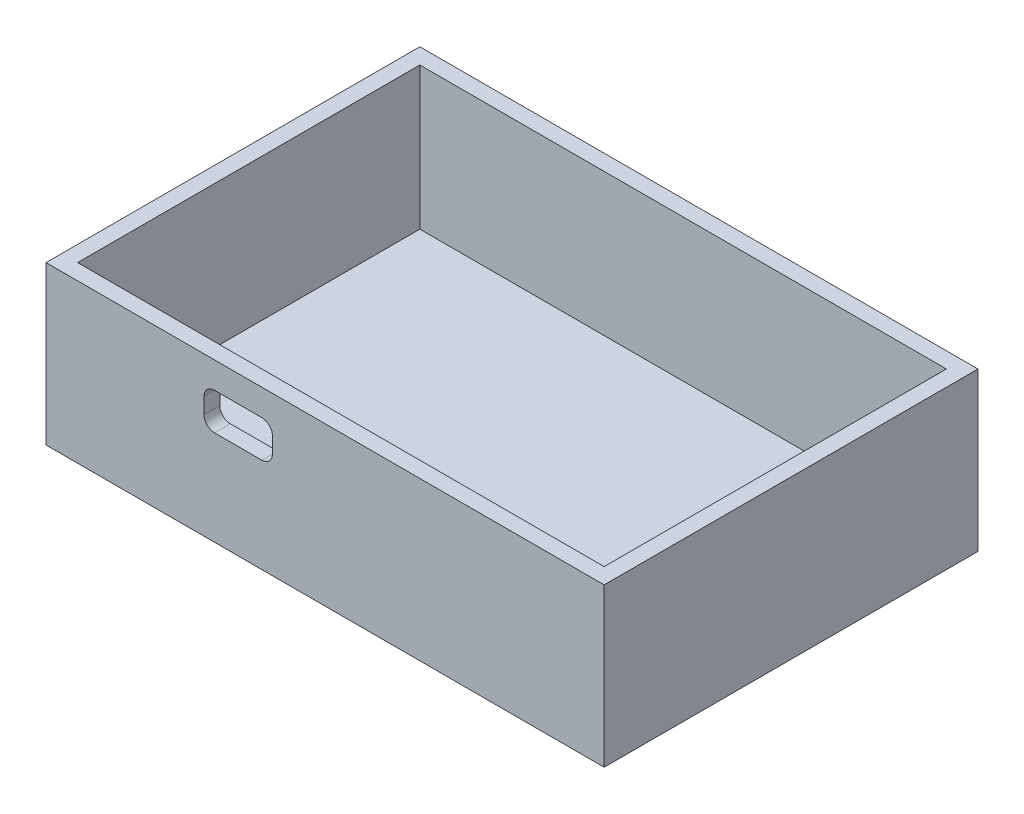
ISO-10303-21;
HEADER;
FILE_DESCRIPTION(('STEP AP214'),'2;1');
FILE_NAME('part.step','',(''),(''),'','','');
FILE_SCHEMA(('AUTOMOTIVE_DESIGN { 1 0 10303 214 1 1 1 1 }'));
ENDSEC;
DATA;
#1=APPLICATION_CONTEXT('core data for automotive mechanical design processes');
#2=APPLICATION_PROTOCOL_DEFINITION('international standard','automotive_design',2000,#1);
#3=PRODUCT_CONTEXT('',#1,'mechanical');
#4=PRODUCT('Part','Part','',(#3));
#5=PRODUCT_RELATED_PRODUCT_CATEGORY('part','',(#4));
#6=PRODUCT_DEFINITION_FORMATION('','',#4);
#7=PRODUCT_DEFINITION_CONTEXT('part definition',#1,'design');
#8=PRODUCT_DEFINITION('design','',#6,#7);
#9=PRODUCT_DEFINITION_SHAPE('','',#8);
#10=(LENGTH_UNIT() NAMED_UNIT(*) SI_UNIT(.MILLI.,.METRE.));
#11=(NAMED_UNIT(*) PLANE_ANGLE_UNIT() SI_UNIT($,.RADIAN.));
#12=(NAMED_UNIT(*) SI_UNIT($,.STERADIAN.) SOLID_ANGLE_UNIT());
#13=UNCERTAINTY_MEASURE_WITH_UNIT(LENGTH_MEASURE(1.E-05),#10,'distance_accuracy_value','');
#14=(GEOMETRIC_REPRESENTATION_CONTEXT(3) GLOBAL_UNCERTAINTY_ASSIGNED_CONTEXT((#13)) GLOBAL_UNIT_ASSIGNED_CONTEXT((#10,
#11,#12)) REPRESENTATION_CONTEXT('',''));
#15=CARTESIAN_POINT('',(0.,0.,0.));
#16=DIRECTION('',(0.,0.,1.));
#17=DIRECTION('',(1.,0.,0.));
#18=AXIS2_PLACEMENT_3D('',#15,#16,#17);
#19=CARTESIAN_POINT('',(-54.822129914844,30.,-39.3590308370044));
#20=DIRECTION('',(1.,0.,0.));
#21=DIRECTION('',(0.,0.,-1.));
#22=AXIS2_PLACEMENT_3D('',#19,#20,#21);
#23=PLANE('',#22);
#24=DIRECTION('',(0.,0.,1.));
#25=VECTOR('',#24,1.);
#26=CARTESIAN_POINT('',(-54.822129914844,0.,-39.3590308370044));
#27=LINE('',#26,#25);
#28=CARTESIAN_POINT('',(-54.822129914844,0.,-39.3590308370044));
#29=VERTEX_POINT('',#28);
#30=CARTESIAN_POINT('',(-54.822129914844,0.,31.6409691629956));
#31=VERTEX_POINT('',#30);
#32=EDGE_CURVE('E207',#29,#31,#27,.T.);
#33=ORIENTED_EDGE('',*,*,#32,.T.);
#34=DIRECTION('',(0.,-1.,0.));
#35=VECTOR('',#34,1.);
#36=CARTESIAN_POINT('',(-54.822129914844,30.,31.6409691629956));
#37=LINE('',#36,#35);
#38=CARTESIAN_POINT('',(-54.822129914844,30.,31.6409691629956));
#39=VERTEX_POINT('',#38);
#40=EDGE_CURVE('E250',#39,#31,#37,.T.);
#41=ORIENTED_EDGE('',*,*,#40,.F.);
#42=DIRECTION('',(0.,0.,1.));
#43=VECTOR('',#42,1.);
#44=CARTESIAN_POINT('',(-54.822129914844,30.,-39.3590308370044));
#45=LINE('',#44,#43);
#46=CARTESIAN_POINT('',(-54.822129914844,30.,-39.3590308370044));
#47=VERTEX_POINT('',#46);
#48=EDGE_CURVE('E213',#47,#39,#45,.T.);
#49=ORIENTED_EDGE('',*,*,#48,.F.);
#50=DIRECTION('',(0.,-1.,0.));
#51=VECTOR('',#50,1.);
#52=CARTESIAN_POINT('',(-54.822129914844,30.,-39.3590308370044));
#53=LINE('',#52,#51);
#54=EDGE_CURVE('E227',#47,#29,#53,.T.);
#55=ORIENTED_EDGE('',*,*,#54,.T.);
#56=EDGE_LOOP('',(#33,#41,#49,#55));
#57=FACE_BOUND('',#56,.T.);
#58=ADVANCED_FACE('F40',(#57),#23,.F.);
#59=CARTESIAN_POINT('',(-54.822129914844,30.,31.6409691629956));
#60=DIRECTION('',(0.,0.,-1.));
#61=DIRECTION('',(-1.,0.,0.));
#62=AXIS2_PLACEMENT_3D('',#59,#60,#61);
#63=PLANE('',#62);
#64=DIRECTION('',(0.,-1.,0.));
#65=VECTOR('',#64,1.);
#66=CARTESIAN_POINT('',(-11.822129914844,25.,31.6409691629956));
#67=LINE('',#66,#65);
#68=CARTESIAN_POINT('',(-11.822129914844,23.,31.6409691629956));
#69=VERTEX_POINT('',#68);
#70=CARTESIAN_POINT('',(-11.822129914844,20.,31.6409691629956));
#71=VERTEX_POINT('',#70);
#72=EDGE_CURVE('E322',#69,#71,#67,.T.);
#73=ORIENTED_EDGE('',*,*,#72,.T.);
#74=CARTESIAN_POINT('',(-13.822129914844,20.,31.6409691629956));
#75=DIRECTION('',(0.,0.,-1.));
#76=DIRECTION('',(-1.,0.,0.));
#77=AXIS2_PLACEMENT_3D('',#74,#75,#76);
#78=CIRCLE('',#77,2.);
#79=CARTESIAN_POINT('',(-13.822129914844,18.,31.6409691629956));
#80=VERTEX_POINT('',#79);
#81=EDGE_CURVE('E284',#71,#80,#78,.T.);
#82=ORIENTED_EDGE('',*,*,#81,.T.);
#83=DIRECTION('',(-1.,0.,0.));
#84=VECTOR('',#83,1.);
#85=CARTESIAN_POINT('',(-24.822129914844,18.,31.6409691629956));
#86=LINE('',#85,#84);
#87=CARTESIAN_POINT('',(-22.822129914844,18.,31.6409691629956));
#88=VERTEX_POINT('',#87);
#89=EDGE_CURVE('E198',#80,#88,#86,.T.);
#90=ORIENTED_EDGE('',*,*,#89,.T.);
#91=CARTESIAN_POINT('',(-22.822129914844,20.,31.6409691629956));
#92=DIRECTION('',(0.,0.,-1.));
#93=DIRECTION('',(-1.,0.,0.));
#94=AXIS2_PLACEMENT_3D('',#91,#92,#93);
#95=CIRCLE('',#94,2.);
#96=CARTESIAN_POINT('',(-24.822129914844,20.,31.6409691629956));
#97=VERTEX_POINT('',#96);
#98=EDGE_CURVE('E11',#88,#97,#95,.T.);
#99=ORIENTED_EDGE('',*,*,#98,.T.);
#100=DIRECTION('',(0.,1.,0.));
#101=VECTOR('',#100,1.);
#102=CARTESIAN_POINT('',(-24.822129914844,25.,31.6409691629956));
#103=LINE('',#102,#101);
#104=CARTESIAN_POINT('',(-24.822129914844,23.,31.6409691629956));
#105=VERTEX_POINT('',#104);
#106=EDGE_CURVE('E313',#97,#105,#103,.T.);
#107=ORIENTED_EDGE('',*,*,#106,.T.);
#108=CARTESIAN_POINT('',(-22.822129914844,23.,31.6409691629956));
#109=DIRECTION('',(0.,0.,-1.));
#110=DIRECTION('',(-1.,0.,0.));
#111=AXIS2_PLACEMENT_3D('',#108,#109,#110);
#112=CIRCLE('',#111,2.);
#113=CARTESIAN_POINT('',(-22.822129914844,25.,31.6409691629956));
#114=VERTEX_POINT('',#113);
#115=EDGE_CURVE('E296',#105,#114,#112,.T.);
#116=ORIENTED_EDGE('',*,*,#115,.T.);
#117=DIRECTION('',(1.,0.,0.));
#118=VECTOR('',#117,1.);
#119=CARTESIAN_POINT('',(-24.822129914844,25.,31.6409691629956));
#120=LINE('',#119,#118);
#121=CARTESIAN_POINT('',(-13.822129914844,25.,31.6409691629956));
#122=VERTEX_POINT('',#121);
#123=EDGE_CURVE('E318',#114,#122,#120,.T.);
#124=ORIENTED_EDGE('',*,*,#123,.T.);
#125=CARTESIAN_POINT('',(-13.822129914844,23.,31.6409691629956));
#126=DIRECTION('',(0.,0.,-1.));
#127=DIRECTION('',(-1.,0.,0.));
#128=AXIS2_PLACEMENT_3D('',#125,#126,#127);
#129=CIRCLE('',#128,2.);
#130=EDGE_CURVE('E290',#122,#69,#129,.T.);
#131=ORIENTED_EDGE('',*,*,#130,.T.);
#132=EDGE_LOOP('',(#73,#82,#90,#99,#107,#116,#124,#131));
#133=FACE_BOUND('',#132,.T.);
#134=DIRECTION('',(1.,0.,0.));
#135=VECTOR('',#134,1.);
#136=CARTESIAN_POINT('',(-54.822129914844,0.,31.6409691629956));
#137=LINE('',#136,#135);
#138=CARTESIAN_POINT('',(51.177870085156,0.,31.6409691629956));
#139=VERTEX_POINT('',#138);
#140=EDGE_CURVE('E231',#31,#139,#137,.T.);
#141=ORIENTED_EDGE('',*,*,#140,.T.);
#142=DIRECTION('',(0.,-1.,0.));
#143=VECTOR('',#142,1.);
#144=CARTESIAN_POINT('',(51.177870085156,30.,31.6409691629956));
#145=LINE('',#144,#143);
#146=CARTESIAN_POINT('',(51.177870085156,30.,31.6409691629956));
#147=VERTEX_POINT('',#146);
#148=EDGE_CURVE('E246',#147,#139,#145,.T.);
#149=ORIENTED_EDGE('',*,*,#148,.F.);
#150=DIRECTION('',(1.,0.,0.));
#151=VECTOR('',#150,1.);
#152=CARTESIAN_POINT('',(-54.822129914844,30.,31.6409691629956));
#153=LINE('',#152,#151);
#154=EDGE_CURVE('E217',#39,#147,#153,.T.);
#155=ORIENTED_EDGE('',*,*,#154,.F.);
#156=ORIENTED_EDGE('',*,*,#40,.T.);
#157=EDGE_LOOP('',(#141,#149,#155,#156));
#158=FACE_BOUND('',#157,.T.);
#159=ADVANCED_FACE('F346',(#133,#158),#63,.F.);
#160=CARTESIAN_POINT('',(51.177870085156,30.,-39.3590308370044));
#161=DIRECTION('',(-1.,0.,0.));
#162=DIRECTION('',(0.,0.,1.));
#163=AXIS2_PLACEMENT_3D('',#160,#161,#162);
#164=PLANE('',#163);
#165=DIRECTION('',(0.,0.,-1.));
#166=VECTOR('',#165,1.);
#167=CARTESIAN_POINT('',(51.177870085156,0.,-39.3590308370044));
#168=LINE('',#167,#166);
#169=CARTESIAN_POINT('',(51.177870085156,0.,-39.3590308370044));
#170=VERTEX_POINT('',#169);
#171=EDGE_CURVE('E234',#139,#170,#168,.T.);
#172=ORIENTED_EDGE('',*,*,#171,.T.);
#173=DIRECTION('',(0.,-1.,0.));
#174=VECTOR('',#173,1.);
#175=CARTESIAN_POINT('',(51.177870085156,30.,-39.3590308370044));
#176=LINE('',#175,#174);
#177=CARTESIAN_POINT('',(51.177870085156,30.,-39.3590308370044));
#178=VERTEX_POINT('',#177);
#179=EDGE_CURVE('E242',#178,#170,#176,.T.);
#180=ORIENTED_EDGE('',*,*,#179,.F.);
#181=DIRECTION('',(0.,0.,-1.));
#182=VECTOR('',#181,1.);
#183=CARTESIAN_POINT('',(51.177870085156,30.,-39.3590308370044));
#184=LINE('',#183,#182);
#185=EDGE_CURVE('E221',#147,#178,#184,.T.);
#186=ORIENTED_EDGE('',*,*,#185,.F.);
#187=ORIENTED_EDGE('',*,*,#148,.T.);
#188=EDGE_LOOP('',(#172,#180,#186,#187));
#189=FACE_BOUND('',#188,.T.);
#190=ADVANCED_FACE('F371',(#189),#164,.F.);
#191=CARTESIAN_POINT('',(-54.822129914844,30.,-39.3590308370044));
#192=DIRECTION('',(0.,0.,1.));
#193=DIRECTION('',(1.,0.,0.));
#194=AXIS2_PLACEMENT_3D('',#191,#192,#193);
#195=PLANE('',#194);
#196=DIRECTION('',(-1.,0.,0.));
#197=VECTOR('',#196,1.);
#198=CARTESIAN_POINT('',(-54.822129914844,0.,-39.3590308370044));
#199=LINE('',#198,#197);
#200=EDGE_CURVE('E218',#170,#29,#199,.T.);
#201=ORIENTED_EDGE('',*,*,#200,.T.);
#202=ORIENTED_EDGE('',*,*,#54,.F.);
#203=DIRECTION('',(-1.,0.,0.));
#204=VECTOR('',#203,1.);
#205=CARTESIAN_POINT('',(-54.822129914844,30.,-39.3590308370044));
#206=LINE('',#205,#204);
#207=EDGE_CURVE('E224',#178,#47,#206,.T.);
#208=ORIENTED_EDGE('',*,*,#207,.F.);
#209=ORIENTED_EDGE('',*,*,#179,.T.);
#210=EDGE_LOOP('',(#201,#202,#208,#209));
#211=FACE_BOUND('',#210,.T.);
#212=ADVANCED_FACE('F406',(#211),#195,.F.);
#213=CARTESIAN_POINT('',(0.,30.,0.));
#214=DIRECTION('',(0.,1.,0.));
#215=DIRECTION('',(0.,0.,1.));
#216=AXIS2_PLACEMENT_3D('',#213,#214,#215);
#217=PLANE('',#216);
#218=DIRECTION('',(0.,0.,1.));
#219=VECTOR('',#218,1.);
#220=CARTESIAN_POINT('',(-51.822129914844,30.,-36.3590308370044));
#221=LINE('',#220,#219);
#222=CARTESIAN_POINT('',(-51.822129914844,30.,-36.3590308370044));
#223=VERTEX_POINT('',#222);
#224=CARTESIAN_POINT('',(-51.822129914844,30.,28.6409691629956));
#225=VERTEX_POINT('',#224);
#226=EDGE_CURVE('E161',#223,#225,#221,.T.);
#227=ORIENTED_EDGE('',*,*,#226,.F.);
#228=DIRECTION('',(-1.,0.,0.));
#229=VECTOR('',#228,1.);
#230=CARTESIAN_POINT('',(-51.822129914844,30.,-36.3590308370044));
#231=LINE('',#230,#229);
#232=CARTESIAN_POINT('',(48.177870085156,30.,-36.3590308370044));
#233=VERTEX_POINT('',#232);
#234=EDGE_CURVE('E181',#233,#223,#231,.T.);
#235=ORIENTED_EDGE('',*,*,#234,.F.);
#236=DIRECTION('',(0.,0.,-1.));
#237=VECTOR('',#236,1.);
#238=CARTESIAN_POINT('',(48.177870085156,30.,-36.3590308370044));
#239=LINE('',#238,#237);
#240=CARTESIAN_POINT('',(48.177870085156,30.,28.6409691629956));
#241=VERTEX_POINT('',#240);
#242=EDGE_CURVE('E185',#241,#233,#239,.T.);
#243=ORIENTED_EDGE('',*,*,#242,.F.);
#244=DIRECTION('',(1.,0.,0.));
#245=VECTOR('',#244,1.);
#246=CARTESIAN_POINT('',(-51.822129914844,30.,28.6409691629956));
#247=LINE('',#246,#245);
#248=EDGE_CURVE('E197',#225,#241,#247,.T.);
#249=ORIENTED_EDGE('',*,*,#248,.F.);
#250=EDGE_LOOP('',(#227,#235,#243,#249));
#251=FACE_BOUND('',#250,.T.);
#252=ORIENTED_EDGE('',*,*,#48,.T.);
#253=ORIENTED_EDGE('',*,*,#154,.T.);
#254=ORIENTED_EDGE('',*,*,#185,.T.);
#255=ORIENTED_EDGE('',*,*,#207,.T.);
#256=EDGE_LOOP('',(#252,#253,#254,#255));
#257=FACE_BOUND('',#256,.T.);
#258=ADVANCED_FACE('F403',(#251,#257),#217,.T.);
#259=CARTESIAN_POINT('',(0.,0.,0.));
#260=DIRECTION('',(0.,1.,0.));
#261=DIRECTION('',(0.,0.,1.));
#262=AXIS2_PLACEMENT_3D('',#259,#260,#261);
#263=PLANE('',#262);
#264=ORIENTED_EDGE('',*,*,#32,.F.);
#265=ORIENTED_EDGE('',*,*,#200,.F.);
#266=ORIENTED_EDGE('',*,*,#171,.F.);
#267=ORIENTED_EDGE('',*,*,#140,.F.);
#268=EDGE_LOOP('',(#264,#265,#266,#267));
#269=FACE_BOUND('',#268,.T.);
#270=ADVANCED_FACE('F402',(#269),#263,.F.);
#271=CARTESIAN_POINT('',(-51.822129914844,3.,-36.3590308370044));
#272=DIRECTION('',(-1.,0.,0.));
#273=DIRECTION('',(0.,0.,1.));
#274=AXIS2_PLACEMENT_3D('',#271,#272,#273);
#275=PLANE('',#274);
#276=ORIENTED_EDGE('',*,*,#226,.T.);
#277=DIRECTION('',(0.,1.,0.));
#278=VECTOR('',#277,1.);
#279=CARTESIAN_POINT('',(-51.822129914844,3.,28.6409691629956));
#280=LINE('',#279,#278);
#281=CARTESIAN_POINT('',(-51.822129914844,3.,28.6409691629956));
#282=VERTEX_POINT('',#281);
#283=EDGE_CURVE('E154',#282,#225,#280,.T.);
#284=ORIENTED_EDGE('',*,*,#283,.F.);
#285=DIRECTION('',(0.,0.,1.));
#286=VECTOR('',#285,1.);
#287=CARTESIAN_POINT('',(-51.822129914844,3.,-36.3590308370044));
#288=LINE('',#287,#286);
#289=CARTESIAN_POINT('',(-51.822129914844,3.,-36.3590308370044));
#290=VERTEX_POINT('',#289);
#291=EDGE_CURVE('E158',#290,#282,#288,.T.);
#292=ORIENTED_EDGE('',*,*,#291,.F.);
#293=DIRECTION('',(0.,1.,0.));
#294=VECTOR('',#293,1.);
#295=CARTESIAN_POINT('',(-51.822129914844,3.,-36.3590308370044));
#296=LINE('',#295,#294);
#297=EDGE_CURVE('E204',#290,#223,#296,.T.);
#298=ORIENTED_EDGE('',*,*,#297,.T.);
#299=EDGE_LOOP('',(#276,#284,#292,#298));
#300=FACE_BOUND('',#299,.T.);
#301=ADVANCED_FACE('F156',(#300),#275,.F.);
#302=CARTESIAN_POINT('',(-51.822129914844,3.,-36.3590308370044));
#303=DIRECTION('',(0.,0.,-1.));
#304=DIRECTION('',(-1.,0.,0.));
#305=AXIS2_PLACEMENT_3D('',#302,#303,#304);
#306=PLANE('',#305);
#307=ORIENTED_EDGE('',*,*,#234,.T.);
#308=ORIENTED_EDGE('',*,*,#297,.F.);
#309=DIRECTION('',(-1.,0.,0.));
#310=VECTOR('',#309,1.);
#311=CARTESIAN_POINT('',(-51.822129914844,3.,-36.3590308370044));
#312=LINE('',#311,#310);
#313=CARTESIAN_POINT('',(48.177870085156,3.,-36.3590308370044));
#314=VERTEX_POINT('',#313);
#315=EDGE_CURVE('E167',#314,#290,#312,.T.);
#316=ORIENTED_EDGE('',*,*,#315,.F.);
#317=DIRECTION('',(0.,1.,0.));
#318=VECTOR('',#317,1.);
#319=CARTESIAN_POINT('',(48.177870085156,3.,-36.3590308370044));
#320=LINE('',#319,#318);
#321=EDGE_CURVE('E208',#314,#233,#320,.T.);
#322=ORIENTED_EDGE('',*,*,#321,.T.);
#323=EDGE_LOOP('',(#307,#308,#316,#322));
#324=FACE_BOUND('',#323,.T.);
#325=ADVANCED_FACE('F390',(#324),#306,.F.);
#326=CARTESIAN_POINT('',(48.177870085156,3.,-36.3590308370044));
#327=DIRECTION('',(1.,0.,0.));
#328=DIRECTION('',(0.,0.,-1.));
#329=AXIS2_PLACEMENT_3D('',#326,#327,#328);
#330=PLANE('',#329);
#331=ORIENTED_EDGE('',*,*,#242,.T.);
#332=ORIENTED_EDGE('',*,*,#321,.F.);
#333=DIRECTION('',(0.,0.,-1.));
#334=VECTOR('',#333,1.);
#335=CARTESIAN_POINT('',(48.177870085156,3.,-36.3590308370044));
#336=LINE('',#335,#334);
#337=CARTESIAN_POINT('',(48.177870085156,3.,28.6409691629956));
#338=VERTEX_POINT('',#337);
#339=EDGE_CURVE('E176',#338,#314,#336,.T.);
#340=ORIENTED_EDGE('',*,*,#339,.F.);
#341=DIRECTION('',(0.,1.,0.));
#342=VECTOR('',#341,1.);
#343=CARTESIAN_POINT('',(48.177870085156,3.,28.6409691629956));
#344=LINE('',#343,#342);
#345=EDGE_CURVE('E166',#338,#241,#344,.T.);
#346=ORIENTED_EDGE('',*,*,#345,.T.);
#347=EDGE_LOOP('',(#331,#332,#340,#346));
#348=FACE_BOUND('',#347,.T.);
#349=ADVANCED_FACE('F393',(#348),#330,.F.);
#350=CARTESIAN_POINT('',(-51.822129914844,3.,28.6409691629956));
#351=DIRECTION('',(0.,0.,1.));
#352=DIRECTION('',(1.,0.,0.));
#353=AXIS2_PLACEMENT_3D('',#350,#351,#352);
#354=PLANE('',#353);
#355=DIRECTION('',(1.,0.,0.));
#356=VECTOR('',#355,1.);
#357=CARTESIAN_POINT('',(-24.822129914844,25.,28.6409691629956));
#358=LINE('',#357,#356);
#359=CARTESIAN_POINT('',(-22.822129914844,25.,28.6409691629956));
#360=VERTEX_POINT('',#359);
#361=CARTESIAN_POINT('',(-13.822129914844,25.,28.6409691629956));
#362=VERTEX_POINT('',#361);
#363=EDGE_CURVE('E332',#360,#362,#358,.T.);
#364=ORIENTED_EDGE('',*,*,#363,.F.);
#365=CARTESIAN_POINT('',(-22.822129914844,23.,28.6409691629956));
#366=DIRECTION('',(0.,0.,1.));
#367=DIRECTION('',(1.,0.,0.));
#368=AXIS2_PLACEMENT_3D('',#365,#366,#367);
#369=CIRCLE('',#368,2.);
#370=CARTESIAN_POINT('',(-24.822129914844,23.,28.6409691629956));
#371=VERTEX_POINT('',#370);
#372=EDGE_CURVE('E293',#360,#371,#369,.T.);
#373=ORIENTED_EDGE('',*,*,#372,.T.);
#374=DIRECTION('',(0.,1.,0.));
#375=VECTOR('',#374,1.);
#376=CARTESIAN_POINT('',(-24.822129914844,25.,28.6409691629956));
#377=LINE('',#376,#375);
#378=CARTESIAN_POINT('',(-24.822129914844,20.,28.6409691629956));
#379=VERTEX_POINT('',#378);
#380=EDGE_CURVE('E304',#379,#371,#377,.T.);
#381=ORIENTED_EDGE('',*,*,#380,.F.);
#382=CARTESIAN_POINT('',(-22.822129914844,20.,28.6409691629956));
#383=DIRECTION('',(0.,0.,1.));
#384=DIRECTION('',(1.,0.,0.));
#385=AXIS2_PLACEMENT_3D('',#382,#383,#384);
#386=CIRCLE('',#385,2.);
#387=CARTESIAN_POINT('',(-22.822129914844,18.,28.6409691629956));
#388=VERTEX_POINT('',#387);
#389=EDGE_CURVE('E49',#379,#388,#386,.T.);
#390=ORIENTED_EDGE('',*,*,#389,.T.);
#391=DIRECTION('',(-1.,0.,0.));
#392=VECTOR('',#391,1.);
#393=CARTESIAN_POINT('',(-24.822129914844,18.,28.6409691629956));
#394=LINE('',#393,#392);
#395=CARTESIAN_POINT('',(-13.822129914844,18.,28.6409691629956));
#396=VERTEX_POINT('',#395);
#397=EDGE_CURVE('E188',#396,#388,#394,.T.);
#398=ORIENTED_EDGE('',*,*,#397,.F.);
#399=CARTESIAN_POINT('',(-13.822129914844,20.,28.6409691629956));
#400=DIRECTION('',(0.,0.,1.));
#401=DIRECTION('',(1.,0.,0.));
#402=AXIS2_PLACEMENT_3D('',#399,#400,#401);
#403=CIRCLE('',#402,2.);
#404=CARTESIAN_POINT('',(-11.822129914844,20.,28.6409691629956));
#405=VERTEX_POINT('',#404);
#406=EDGE_CURVE('E281',#396,#405,#403,.T.);
#407=ORIENTED_EDGE('',*,*,#406,.T.);
#408=DIRECTION('',(0.,-1.,0.));
#409=VECTOR('',#408,1.);
#410=CARTESIAN_POINT('',(-11.822129914844,25.,28.6409691629956));
#411=LINE('',#410,#409);
#412=CARTESIAN_POINT('',(-11.822129914844,23.,28.6409691629956));
#413=VERTEX_POINT('',#412);
#414=EDGE_CURVE('E314',#413,#405,#411,.T.);
#415=ORIENTED_EDGE('',*,*,#414,.F.);
#416=CARTESIAN_POINT('',(-13.822129914844,23.,28.6409691629956));
#417=DIRECTION('',(0.,0.,1.));
#418=DIRECTION('',(1.,0.,0.));
#419=AXIS2_PLACEMENT_3D('',#416,#417,#418);
#420=CIRCLE('',#419,2.);
#421=EDGE_CURVE('E287',#413,#362,#420,.T.);
#422=ORIENTED_EDGE('',*,*,#421,.T.);
#423=EDGE_LOOP('',(#364,#373,#381,#390,#398,#407,#415,#422));
#424=FACE_BOUND('',#423,.T.);
#425=ORIENTED_EDGE('',*,*,#248,.T.);
#426=ORIENTED_EDGE('',*,*,#345,.F.);
#427=DIRECTION('',(1.,0.,0.));
#428=VECTOR('',#427,1.);
#429=CARTESIAN_POINT('',(-51.822129914844,3.,28.6409691629956));
#430=LINE('',#429,#428);
#431=EDGE_CURVE('E170',#282,#338,#430,.T.);
#432=ORIENTED_EDGE('',*,*,#431,.F.);
#433=ORIENTED_EDGE('',*,*,#283,.T.);
#434=EDGE_LOOP('',(#425,#426,#432,#433));
#435=FACE_BOUND('',#434,.T.);
#436=ADVANCED_FACE('F171',(#424,#435),#354,.F.);
#437=CARTESIAN_POINT('',(0.,3.,0.));
#438=DIRECTION('',(0.,1.,0.));
#439=DIRECTION('',(0.,0.,1.));
#440=AXIS2_PLACEMENT_3D('',#437,#438,#439);
#441=PLANE('',#440);
#442=ORIENTED_EDGE('',*,*,#291,.T.);
#443=ORIENTED_EDGE('',*,*,#431,.T.);
#444=ORIENTED_EDGE('',*,*,#339,.T.);
#445=ORIENTED_EDGE('',*,*,#315,.T.);
#446=EDGE_LOOP('',(#442,#443,#444,#445));
#447=FACE_BOUND('',#446,.T.);
#448=ADVANCED_FACE('F178',(#447),#441,.T.);
#449=CARTESIAN_POINT('',(-24.822129914844,25.,31.6409691629956));
#450=DIRECTION('',(-1.,0.,0.));
#451=DIRECTION('',(0.,0.,1.));
#452=AXIS2_PLACEMENT_3D('',#449,#450,#451);
#453=PLANE('',#452);
#454=ORIENTED_EDGE('',*,*,#380,.T.);
#455=DIRECTION('',(0.,0.,-1.));
#456=VECTOR('',#455,1.);
#457=CARTESIAN_POINT('',(-24.822129914844,23.,31.6409691629956));
#458=LINE('',#457,#456);
#459=EDGE_CURVE('E56',#371,#105,#458,.F.);
#460=ORIENTED_EDGE('',*,*,#459,.T.);
#461=ORIENTED_EDGE('',*,*,#106,.F.);
#462=DIRECTION('',(0.,0.,-1.));
#463=VECTOR('',#462,1.);
#464=CARTESIAN_POINT('',(-24.822129914844,20.,28.6409691629956));
#465=LINE('',#464,#463);
#466=EDGE_CURVE('E275',#97,#379,#465,.T.);
#467=ORIENTED_EDGE('',*,*,#466,.T.);
#468=EDGE_LOOP('',(#454,#460,#461,#467));
#469=FACE_BOUND('',#468,.T.);
#470=ADVANCED_FACE('F315',(#469),#453,.F.);
#471=CARTESIAN_POINT('',(-24.822129914844,18.,31.6409691629956));
#472=DIRECTION('',(0.,-1.,0.));
#473=DIRECTION('',(0.,0.,-1.));
#474=AXIS2_PLACEMENT_3D('',#471,#472,#473);
#475=PLANE('',#474);
#476=ORIENTED_EDGE('',*,*,#89,.F.);
#477=DIRECTION('',(0.,0.,-1.));
#478=VECTOR('',#477,1.);
#479=CARTESIAN_POINT('',(-13.822129914844,18.,28.6409691629956));
#480=LINE('',#479,#478);
#481=EDGE_CURVE('E257',#80,#396,#480,.T.);
#482=ORIENTED_EDGE('',*,*,#481,.T.);
#483=ORIENTED_EDGE('',*,*,#397,.T.);
#484=DIRECTION('',(0.,0.,-1.));
#485=VECTOR('',#484,1.);
#486=CARTESIAN_POINT('',(-22.822129914844,18.,31.6409691629956));
#487=LINE('',#486,#485);
#488=EDGE_CURVE('E254',#388,#88,#487,.F.);
#489=ORIENTED_EDGE('',*,*,#488,.T.);
#490=EDGE_LOOP('',(#476,#482,#483,#489));
#491=FACE_BOUND('',#490,.T.);
#492=ADVANCED_FACE('F310',(#491),#475,.F.);
#493=CARTESIAN_POINT('',(-11.822129914844,25.,31.6409691629956));
#494=DIRECTION('',(1.,0.,0.));
#495=DIRECTION('',(0.,0.,-1.));
#496=AXIS2_PLACEMENT_3D('',#493,#494,#495);
#497=PLANE('',#496);
#498=ORIENTED_EDGE('',*,*,#414,.T.);
#499=DIRECTION('',(0.,0.,-1.));
#500=VECTOR('',#499,1.);
#501=CARTESIAN_POINT('',(-11.822129914844,20.,31.6409691629956));
#502=LINE('',#501,#500);
#503=EDGE_CURVE('E265',#405,#71,#502,.F.);
#504=ORIENTED_EDGE('',*,*,#503,.T.);
#505=ORIENTED_EDGE('',*,*,#72,.F.);
#506=DIRECTION('',(0.,0.,-1.));
#507=VECTOR('',#506,1.);
#508=CARTESIAN_POINT('',(-11.822129914844,23.,28.6409691629956));
#509=LINE('',#508,#507);
#510=EDGE_CURVE('E261',#69,#413,#509,.T.);
#511=ORIENTED_EDGE('',*,*,#510,.T.);
#512=EDGE_LOOP('',(#498,#504,#505,#511));
#513=FACE_BOUND('',#512,.T.);
#514=ADVANCED_FACE('F340',(#513),#497,.F.);
#515=CARTESIAN_POINT('',(-24.822129914844,25.,31.6409691629956));
#516=DIRECTION('',(0.,1.,0.));
#517=DIRECTION('',(0.,0.,1.));
#518=AXIS2_PLACEMENT_3D('',#515,#516,#517);
#519=PLANE('',#518);
#520=ORIENTED_EDGE('',*,*,#363,.T.);
#521=DIRECTION('',(0.,0.,-1.));
#522=VECTOR('',#521,1.);
#523=CARTESIAN_POINT('',(-13.822129914844,25.,31.6409691629956));
#524=LINE('',#523,#522);
#525=EDGE_CURVE('E272',#362,#122,#524,.F.);
#526=ORIENTED_EDGE('',*,*,#525,.T.);
#527=ORIENTED_EDGE('',*,*,#123,.F.);
#528=DIRECTION('',(0.,0.,-1.));
#529=VECTOR('',#528,1.);
#530=CARTESIAN_POINT('',(-22.822129914844,25.,28.6409691629956));
#531=LINE('',#530,#529);
#532=EDGE_CURVE('E268',#114,#360,#531,.T.);
#533=ORIENTED_EDGE('',*,*,#532,.T.);
#534=EDGE_LOOP('',(#520,#526,#527,#533));
#535=FACE_BOUND('',#534,.T.);
#536=ADVANCED_FACE('F353',(#535),#519,.F.);
#537=CARTESIAN_POINT('',(-13.822129914844,20.,31.6409691629956));
#538=DIRECTION('',(0.,0.,1.));
#539=DIRECTION('',(1.,0.,0.));
#540=AXIS2_PLACEMENT_3D('',#537,#538,#539);
#541=CYLINDRICAL_SURFACE('',#540,2.);
#542=ORIENTED_EDGE('',*,*,#81,.F.);
#543=ORIENTED_EDGE('',*,*,#503,.F.);
#544=ORIENTED_EDGE('',*,*,#406,.F.);
#545=ORIENTED_EDGE('',*,*,#481,.F.);
#546=EDGE_LOOP('',(#542,#543,#544,#545));
#547=FACE_BOUND('',#546,.T.);
#548=ADVANCED_FACE('F345',(#547),#541,.F.);
#549=CARTESIAN_POINT('',(-13.822129914844,23.,31.6409691629956));
#550=DIRECTION('',(0.,0.,1.));
#551=DIRECTION('',(1.,0.,0.));
#552=AXIS2_PLACEMENT_3D('',#549,#550,#551);
#553=CYLINDRICAL_SURFACE('',#552,2.);
#554=ORIENTED_EDGE('',*,*,#130,.F.);
#555=ORIENTED_EDGE('',*,*,#525,.F.);
#556=ORIENTED_EDGE('',*,*,#421,.F.);
#557=ORIENTED_EDGE('',*,*,#510,.F.);
#558=EDGE_LOOP('',(#554,#555,#556,#557));
#559=FACE_BOUND('',#558,.T.);
#560=ADVANCED_FACE('F350',(#559),#553,.F.);
#561=CARTESIAN_POINT('',(-22.822129914844,23.,31.6409691629956));
#562=DIRECTION('',(0.,0.,1.));
#563=DIRECTION('',(1.,0.,0.));
#564=AXIS2_PLACEMENT_3D('',#561,#562,#563);
#565=CYLINDRICAL_SURFACE('',#564,2.);
#566=ORIENTED_EDGE('',*,*,#115,.F.);
#567=ORIENTED_EDGE('',*,*,#459,.F.);
#568=ORIENTED_EDGE('',*,*,#372,.F.);
#569=ORIENTED_EDGE('',*,*,#532,.F.);
#570=EDGE_LOOP('',(#566,#567,#568,#569));
#571=FACE_BOUND('',#570,.T.);
#572=ADVANCED_FACE('F357',(#571),#565,.F.);
#573=CARTESIAN_POINT('',(-22.822129914844,20.,31.6409691629956));
#574=DIRECTION('',(0.,0.,1.));
#575=DIRECTION('',(1.,0.,0.));
#576=AXIS2_PLACEMENT_3D('',#573,#574,#575);
#577=CYLINDRICAL_SURFACE('',#576,2.);
#578=ORIENTED_EDGE('',*,*,#98,.F.);
#579=ORIENTED_EDGE('',*,*,#488,.F.);
#580=ORIENTED_EDGE('',*,*,#389,.F.);
#581=ORIENTED_EDGE('',*,*,#466,.F.);
#582=EDGE_LOOP('',(#578,#579,#580,#581));
#583=FACE_BOUND('',#582,.T.);
#584=ADVANCED_FACE('F42',(#583),#577,.F.);
#585=CLOSED_SHELL('',(#58,#159,#190,#212,#258,#270,#301,#325,#349,#436,#448,#470,#492,#514,#536,
#548,#560,#572,#584));
#586=MANIFOLD_SOLID_BREP('B2',#585);
#587=ADVANCED_BREP_SHAPE_REPRESENTATION('',(#18,#586),#14);
#588=SHAPE_DEFINITION_REPRESENTATION(#9,#587);
ENDSEC;
END-ISO-10303-21;
